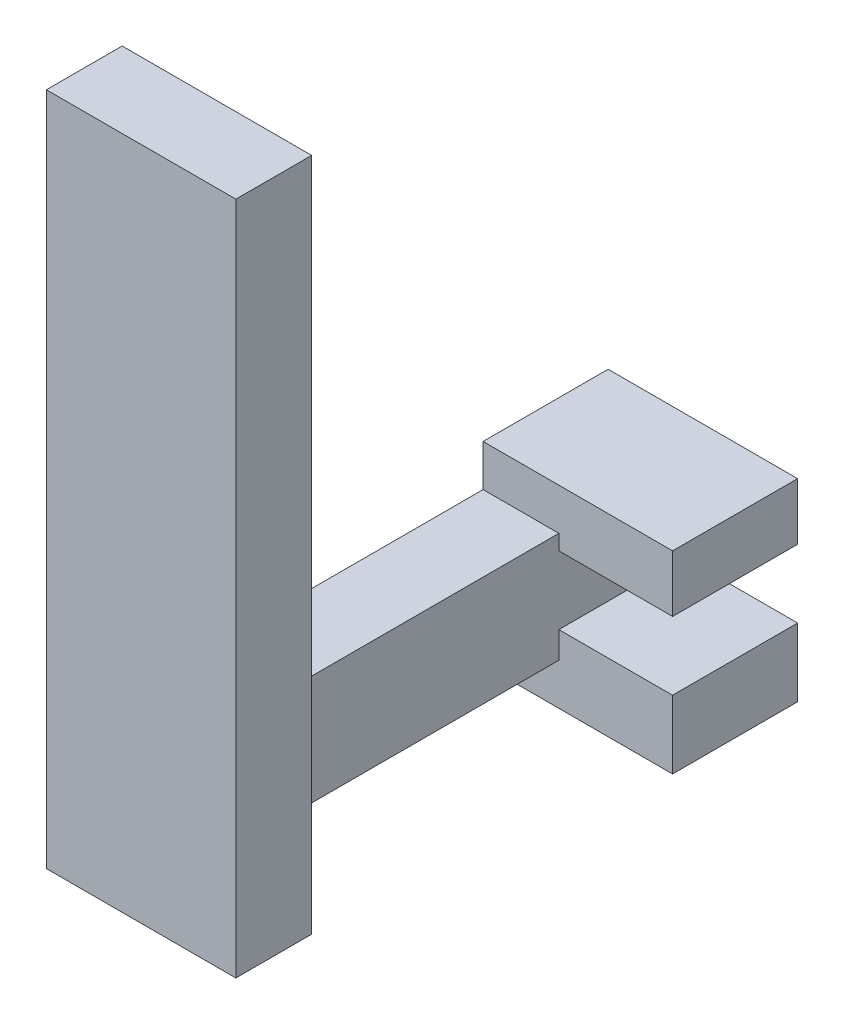
ISO-10303-21;
HEADER;
FILE_DESCRIPTION(('STEP AP214'),'2;1');
FILE_NAME('part.step','',(''),(''),'','','');
FILE_SCHEMA(('AUTOMOTIVE_DESIGN { 1 0 10303 214 1 1 1 1 }'));
ENDSEC;
DATA;
#1=APPLICATION_CONTEXT('core data for automotive mechanical design processes');
#2=APPLICATION_PROTOCOL_DEFINITION('international standard','automotive_design',2000,#1);
#3=PRODUCT_CONTEXT('',#1,'mechanical');
#4=PRODUCT('Part','Part','',(#3));
#5=PRODUCT_RELATED_PRODUCT_CATEGORY('part','',(#4));
#6=PRODUCT_DEFINITION_FORMATION('','',#4);
#7=PRODUCT_DEFINITION_CONTEXT('part definition',#1,'design');
#8=PRODUCT_DEFINITION('design','',#6,#7);
#9=PRODUCT_DEFINITION_SHAPE('','',#8);
#10=(LENGTH_UNIT() NAMED_UNIT(*) SI_UNIT(.MILLI.,.METRE.));
#11=(NAMED_UNIT(*) PLANE_ANGLE_UNIT() SI_UNIT($,.RADIAN.));
#12=(NAMED_UNIT(*) SI_UNIT($,.STERADIAN.) SOLID_ANGLE_UNIT());
#13=UNCERTAINTY_MEASURE_WITH_UNIT(LENGTH_MEASURE(1.E-05),#10,'distance_accuracy_value','');
#14=(GEOMETRIC_REPRESENTATION_CONTEXT(3) GLOBAL_UNCERTAINTY_ASSIGNED_CONTEXT((#13)) GLOBAL_UNIT_ASSIGNED_CONTEXT((#10,
#11,#12)) REPRESENTATION_CONTEXT('',''));
#15=CARTESIAN_POINT('',(0.,0.,0.));
#16=DIRECTION('',(0.,0.,1.));
#17=DIRECTION('',(1.,0.,0.));
#18=AXIS2_PLACEMENT_3D('',#15,#16,#17);
#19=CARTESIAN_POINT('',(1.,2.9,6.));
#20=DIRECTION('',(-1.,0.,0.));
#21=DIRECTION('',(0.,0.,1.));
#22=AXIS2_PLACEMENT_3D('',#19,#20,#21);
#23=PLANE('',#22);
#24=DIRECTION('',(0.,1.,0.));
#25=VECTOR('',#24,1.);
#26=CARTESIAN_POINT('',(1.,2.9,6.825));
#27=LINE('',#26,#25);
#28=CARTESIAN_POINT('',(1.,0.,6.825));
#29=VERTEX_POINT('',#28);
#30=CARTESIAN_POINT('',(1.,2.9,6.825));
#31=VERTEX_POINT('',#30);
#32=EDGE_CURVE('E206',#29,#31,#27,.T.);
#33=ORIENTED_EDGE('',*,*,#32,.F.);
#34=DIRECTION('',(0.,0.,-1.));
#35=VECTOR('',#34,1.);
#36=CARTESIAN_POINT('',(1.,0.,6.));
#37=LINE('',#36,#35);
#38=CARTESIAN_POINT('',(1.,0.,-2.7));
#39=VERTEX_POINT('',#38);
#40=EDGE_CURVE('E265',#29,#39,#37,.T.);
#41=ORIENTED_EDGE('',*,*,#40,.T.);
#42=DIRECTION('',(0.,1.,0.));
#43=VECTOR('',#42,1.);
#44=CARTESIAN_POINT('',(1.,2.9,-2.7));
#45=LINE('',#44,#43);
#46=CARTESIAN_POINT('',(1.,0.7,-2.7));
#47=VERTEX_POINT('',#46);
#48=EDGE_CURVE('E213',#39,#47,#45,.T.);
#49=ORIENTED_EDGE('',*,*,#48,.T.);
#50=DIRECTION('',(0.,0.,-1.));
#51=VECTOR('',#50,1.);
#52=CARTESIAN_POINT('',(1.,0.699999999999998,6.));
#53=LINE('',#52,#51);
#54=CARTESIAN_POINT('',(1.,0.7,-6.));
#55=VERTEX_POINT('',#54);
#56=EDGE_CURVE('E234',#47,#55,#53,.T.);
#57=ORIENTED_EDGE('',*,*,#56,.T.);
#58=DIRECTION('',(0.,-1.,0.));
#59=VECTOR('',#58,1.);
#60=CARTESIAN_POINT('',(1.,2.9,-6.));
#61=LINE('',#60,#59);
#62=CARTESIAN_POINT('',(1.,2.5,-6.));
#63=VERTEX_POINT('',#62);
#64=EDGE_CURVE('E276',#63,#55,#61,.T.);
#65=ORIENTED_EDGE('',*,*,#64,.F.);
#66=DIRECTION('',(0.,0.,1.));
#67=VECTOR('',#66,1.);
#68=CARTESIAN_POINT('',(1.,2.5,6.));
#69=LINE('',#68,#67);
#70=CARTESIAN_POINT('',(1.,2.5,-2.7));
#71=VERTEX_POINT('',#70);
#72=EDGE_CURVE('E80',#63,#71,#69,.T.);
#73=ORIENTED_EDGE('',*,*,#72,.T.);
#74=DIRECTION('',(0.,1.,0.));
#75=VECTOR('',#74,1.);
#76=CARTESIAN_POINT('',(1.,2.9,-2.7));
#77=LINE('',#76,#75);
#78=CARTESIAN_POINT('',(1.,2.9,-2.7));
#79=VERTEX_POINT('',#78);
#80=EDGE_CURVE('E244',#71,#79,#77,.T.);
#81=ORIENTED_EDGE('',*,*,#80,.T.);
#82=DIRECTION('',(0.,0.,-1.));
#83=VECTOR('',#82,1.);
#84=CARTESIAN_POINT('',(1.,2.9,6.));
#85=LINE('',#84,#83);
#86=EDGE_CURVE('E266',#31,#79,#85,.T.);
#87=ORIENTED_EDGE('',*,*,#86,.F.);
#88=EDGE_LOOP('',(#33,#41,#49,#57,#65,#73,#81,#87));
#89=FACE_BOUND('',#88,.T.);
#90=ADVANCED_FACE('F59',(#89),#23,.F.);
#91=CARTESIAN_POINT('',(0.,2.9,0.));
#92=DIRECTION('',(0.,-1.,0.));
#93=DIRECTION('',(0.,0.,-1.));
#94=AXIS2_PLACEMENT_3D('',#91,#92,#93);
#95=PLANE('',#94);
#96=DIRECTION('',(-1.,0.,0.));
#97=VECTOR('',#96,1.);
#98=CARTESIAN_POINT('',(0.,2.9,6.825));
#99=LINE('',#98,#97);
#100=CARTESIAN_POINT('',(-1.,2.9,6.825));
#101=VERTEX_POINT('',#100);
#102=EDGE_CURVE('E174',#31,#101,#99,.T.);
#103=ORIENTED_EDGE('',*,*,#102,.F.);
#104=ORIENTED_EDGE('',*,*,#86,.T.);
#105=DIRECTION('',(-1.,0.,0.));
#106=VECTOR('',#105,1.);
#107=CARTESIAN_POINT('',(0.,2.9,-2.7));
#108=LINE('',#107,#106);
#109=CARTESIAN_POINT('',(-1.,2.9,-2.7));
#110=VERTEX_POINT('',#109);
#111=EDGE_CURVE('E66',#79,#110,#108,.T.);
#112=ORIENTED_EDGE('',*,*,#111,.T.);
#113=DIRECTION('',(0.,0.,1.));
#114=VECTOR('',#113,1.);
#115=CARTESIAN_POINT('',(-1.,2.9,6.));
#116=LINE('',#115,#114);
#117=EDGE_CURVE('E268',#110,#101,#116,.T.);
#118=ORIENTED_EDGE('',*,*,#117,.T.);
#119=EDGE_LOOP('',(#103,#104,#112,#118));
#120=FACE_BOUND('',#119,.T.);
#121=ADVANCED_FACE('F283',(#120),#95,.F.);
#122=CARTESIAN_POINT('',(-1.,2.9,-6.));
#123=DIRECTION('',(0.,0.,1.));
#124=DIRECTION('',(1.,0.,0.));
#125=AXIS2_PLACEMENT_3D('',#122,#123,#124);
#126=PLANE('',#125);
#127=ORIENTED_EDGE('',*,*,#64,.T.);
#128=DIRECTION('',(1.,0.,0.));
#129=VECTOR('',#128,1.);
#130=CARTESIAN_POINT('',(-4.7589892258425,0.7,-6.));
#131=LINE('',#130,#129);
#132=CARTESIAN_POINT('',(4.,0.7,-6.));
#133=VERTEX_POINT('',#132);
#134=EDGE_CURVE('E225',#55,#133,#131,.T.);
#135=ORIENTED_EDGE('',*,*,#134,.T.);
#136=DIRECTION('',(0.,1.,0.));
#137=VECTOR('',#136,1.);
#138=CARTESIAN_POINT('',(4.,0.7,-6.));
#139=LINE('',#138,#137);
#140=CARTESIAN_POINT('',(4.,-1.1,-6.));
#141=VERTEX_POINT('',#140);
#142=EDGE_CURVE('E208',#141,#133,#139,.T.);
#143=ORIENTED_EDGE('',*,*,#142,.F.);
#144=DIRECTION('',(1.,0.,0.));
#145=VECTOR('',#144,1.);
#146=CARTESIAN_POINT('',(-4.7589892258425,-1.1,-6.));
#147=LINE('',#146,#145);
#148=CARTESIAN_POINT('',(-1.,-1.1,-6.));
#149=VERTEX_POINT('',#148);
#150=EDGE_CURVE('E211',#149,#141,#147,.T.);
#151=ORIENTED_EDGE('',*,*,#150,.F.);
#152=DIRECTION('',(0.,-1.,0.));
#153=VECTOR('',#152,1.);
#154=CARTESIAN_POINT('',(-1.,2.9,-6.));
#155=LINE('',#154,#153);
#156=CARTESIAN_POINT('',(-1.,4.,-6.));
#157=VERTEX_POINT('',#156);
#158=EDGE_CURVE('E272',#157,#149,#155,.T.);
#159=ORIENTED_EDGE('',*,*,#158,.F.);
#160=DIRECTION('',(1.,0.,0.));
#161=VECTOR('',#160,1.);
#162=CARTESIAN_POINT('',(-4.7589892258425,4.,-6.));
#163=LINE('',#162,#161);
#164=CARTESIAN_POINT('',(4.,4.,-6.));
#165=VERTEX_POINT('',#164);
#166=EDGE_CURVE('E258',#157,#165,#163,.T.);
#167=ORIENTED_EDGE('',*,*,#166,.T.);
#168=DIRECTION('',(0.,1.,0.));
#169=VECTOR('',#168,1.);
#170=CARTESIAN_POINT('',(4.,2.5,-6.));
#171=LINE('',#170,#169);
#172=CARTESIAN_POINT('',(4.,2.5,-6.));
#173=VERTEX_POINT('',#172);
#174=EDGE_CURVE('E250',#173,#165,#171,.T.);
#175=ORIENTED_EDGE('',*,*,#174,.F.);
#176=DIRECTION('',(1.,0.,0.));
#177=VECTOR('',#176,1.);
#178=CARTESIAN_POINT('',(-4.7589892258425,2.5,-6.));
#179=LINE('',#178,#177);
#180=EDGE_CURVE('E260',#63,#173,#179,.T.);
#181=ORIENTED_EDGE('',*,*,#180,.F.);
#182=EDGE_LOOP('',(#127,#135,#143,#151,#159,#167,#175,#181));
#183=FACE_BOUND('',#182,.T.);
#184=ADVANCED_FACE('F297',(#183),#126,.F.);
#185=CARTESIAN_POINT('',(-1.,2.9,6.));
#186=DIRECTION('',(1.,0.,0.));
#187=DIRECTION('',(0.,0.,-1.));
#188=AXIS2_PLACEMENT_3D('',#185,#186,#187);
#189=PLANE('',#188);
#190=DIRECTION('',(0.,-1.,0.));
#191=VECTOR('',#190,1.);
#192=CARTESIAN_POINT('',(-1.,17.8,6.825));
#193=LINE('',#192,#191);
#194=CARTESIAN_POINT('',(-1.,17.8,6.825));
#195=VERTEX_POINT('',#194);
#196=EDGE_CURVE('E175',#195,#101,#193,.T.);
#197=ORIENTED_EDGE('',*,*,#196,.T.);
#198=ORIENTED_EDGE('',*,*,#117,.F.);
#199=DIRECTION('',(0.,1.,0.));
#200=VECTOR('',#199,1.);
#201=CARTESIAN_POINT('',(-1.,2.5,-2.7));
#202=LINE('',#201,#200);
#203=CARTESIAN_POINT('',(-1.,4.,-2.7));
#204=VERTEX_POINT('',#203);
#205=EDGE_CURVE('E241',#110,#204,#202,.T.);
#206=ORIENTED_EDGE('',*,*,#205,.T.);
#207=DIRECTION('',(0.,0.,-1.));
#208=VECTOR('',#207,1.);
#209=CARTESIAN_POINT('',(-1.,4.,-2.7));
#210=LINE('',#209,#208);
#211=EDGE_CURVE('E238',#204,#157,#210,.T.);
#212=ORIENTED_EDGE('',*,*,#211,.T.);
#213=ORIENTED_EDGE('',*,*,#158,.T.);
#214=DIRECTION('',(0.,0.,1.));
#215=VECTOR('',#214,1.);
#216=CARTESIAN_POINT('',(-1.,-1.1,-6.));
#217=LINE('',#216,#215);
#218=CARTESIAN_POINT('',(-1.,-1.1,-2.7));
#219=VERTEX_POINT('',#218);
#220=EDGE_CURVE('E210',#149,#219,#217,.T.);
#221=ORIENTED_EDGE('',*,*,#220,.T.);
#222=DIRECTION('',(0.,1.,0.));
#223=VECTOR('',#222,1.);
#224=CARTESIAN_POINT('',(-1.,0.7,-2.7));
#225=LINE('',#224,#223);
#226=CARTESIAN_POINT('',(-1.,0.,-2.7));
#227=VERTEX_POINT('',#226);
#228=EDGE_CURVE('E73',#219,#227,#225,.T.);
#229=ORIENTED_EDGE('',*,*,#228,.T.);
#230=DIRECTION('',(0.,0.,1.));
#231=VECTOR('',#230,1.);
#232=CARTESIAN_POINT('',(-1.,0.,6.));
#233=LINE('',#232,#231);
#234=CARTESIAN_POINT('',(-0.999999999999999,0.,8.825));
#235=VERTEX_POINT('',#234);
#236=EDGE_CURVE('E269',#227,#235,#233,.T.);
#237=ORIENTED_EDGE('',*,*,#236,.T.);
#238=DIRECTION('',(0.,-1.,0.));
#239=VECTOR('',#238,1.);
#240=CARTESIAN_POINT('',(-0.999999999999999,17.8,8.825));
#241=LINE('',#240,#239);
#242=CARTESIAN_POINT('',(-0.999999999999999,17.8,8.825));
#243=VERTEX_POINT('',#242);
#244=EDGE_CURVE('E194',#243,#235,#241,.T.);
#245=ORIENTED_EDGE('',*,*,#244,.F.);
#246=DIRECTION('',(0.,0.,1.));
#247=VECTOR('',#246,1.);
#248=CARTESIAN_POINT('',(-1.,17.8,0.));
#249=LINE('',#248,#247);
#250=EDGE_CURVE('E188',#195,#243,#249,.T.);
#251=ORIENTED_EDGE('',*,*,#250,.F.);
#252=EDGE_LOOP('',(#197,#198,#206,#212,#213,#221,#229,#237,#245,#251));
#253=FACE_BOUND('',#252,.T.);
#254=ADVANCED_FACE('F290',(#253),#189,.F.);
#255=CARTESIAN_POINT('',(0.,0.,0.));
#256=DIRECTION('',(0.,-1.,0.));
#257=DIRECTION('',(0.,0.,-1.));
#258=AXIS2_PLACEMENT_3D('',#255,#256,#257);
#259=PLANE('',#258);
#260=ORIENTED_EDGE('',*,*,#40,.F.);
#261=DIRECTION('',(-1.,0.,0.));
#262=VECTOR('',#261,1.);
#263=CARTESIAN_POINT('',(0.,0.,6.825));
#264=LINE('',#263,#262);
#265=CARTESIAN_POINT('',(4.,0.,6.825));
#266=VERTEX_POINT('',#265);
#267=EDGE_CURVE('E190',#266,#29,#264,.T.);
#268=ORIENTED_EDGE('',*,*,#267,.F.);
#269=DIRECTION('',(0.,0.,1.));
#270=VECTOR('',#269,1.);
#271=CARTESIAN_POINT('',(4.,0.,0.));
#272=LINE('',#271,#270);
#273=CARTESIAN_POINT('',(4.,0.,8.825));
#274=VERTEX_POINT('',#273);
#275=EDGE_CURVE('E171',#266,#274,#272,.T.);
#276=ORIENTED_EDGE('',*,*,#275,.T.);
#277=DIRECTION('',(-1.,0.,0.));
#278=VECTOR('',#277,1.);
#279=CARTESIAN_POINT('',(0.,0.,8.825));
#280=LINE('',#279,#278);
#281=EDGE_CURVE('E199',#274,#235,#280,.T.);
#282=ORIENTED_EDGE('',*,*,#281,.T.);
#283=ORIENTED_EDGE('',*,*,#236,.F.);
#284=DIRECTION('',(-1.,0.,0.));
#285=VECTOR('',#284,1.);
#286=CARTESIAN_POINT('',(0.,0.,-2.7));
#287=LINE('',#286,#285);
#288=EDGE_CURVE('E12',#39,#227,#287,.T.);
#289=ORIENTED_EDGE('',*,*,#288,.F.);
#290=EDGE_LOOP('',(#260,#268,#276,#282,#283,#289));
#291=FACE_BOUND('',#290,.T.);
#292=ADVANCED_FACE('F327',(#291),#259,.T.);
#293=CARTESIAN_POINT('',(-4.7589892258425,2.5,-2.7));
#294=DIRECTION('',(0.,-1.,0.));
#295=DIRECTION('',(0.,0.,-1.));
#296=AXIS2_PLACEMENT_3D('',#293,#294,#295);
#297=PLANE('',#296);
#298=ORIENTED_EDGE('',*,*,#72,.F.);
#299=ORIENTED_EDGE('',*,*,#180,.T.);
#300=DIRECTION('',(0.,0.,-1.));
#301=VECTOR('',#300,1.);
#302=CARTESIAN_POINT('',(4.,2.5,-2.7));
#303=LINE('',#302,#301);
#304=CARTESIAN_POINT('',(4.,2.5,-2.7));
#305=VERTEX_POINT('',#304);
#306=EDGE_CURVE('E247',#305,#173,#303,.T.);
#307=ORIENTED_EDGE('',*,*,#306,.F.);
#308=DIRECTION('',(1.,0.,0.));
#309=VECTOR('',#308,1.);
#310=CARTESIAN_POINT('',(-4.7589892258425,2.5,-2.7));
#311=LINE('',#310,#309);
#312=EDGE_CURVE('E256',#71,#305,#311,.T.);
#313=ORIENTED_EDGE('',*,*,#312,.F.);
#314=EDGE_LOOP('',(#298,#299,#307,#313));
#315=FACE_BOUND('',#314,.T.);
#316=ADVANCED_FACE('F305',(#315),#297,.T.);
#317=CARTESIAN_POINT('',(-4.7589892258425,2.5,-2.7));
#318=DIRECTION('',(0.,0.,1.));
#319=DIRECTION('',(1.,0.,0.));
#320=AXIS2_PLACEMENT_3D('',#317,#318,#319);
#321=PLANE('',#320);
#322=ORIENTED_EDGE('',*,*,#80,.F.);
#323=ORIENTED_EDGE('',*,*,#312,.T.);
#324=DIRECTION('',(0.,-1.,0.));
#325=VECTOR('',#324,1.);
#326=CARTESIAN_POINT('',(4.,2.5,-2.7));
#327=LINE('',#326,#325);
#328=CARTESIAN_POINT('',(4.,4.,-2.7));
#329=VERTEX_POINT('',#328);
#330=EDGE_CURVE('E237',#329,#305,#327,.T.);
#331=ORIENTED_EDGE('',*,*,#330,.F.);
#332=DIRECTION('',(1.,0.,0.));
#333=VECTOR('',#332,1.);
#334=CARTESIAN_POINT('',(-4.7589892258425,4.,-2.7));
#335=LINE('',#334,#333);
#336=EDGE_CURVE('E242',#204,#329,#335,.T.);
#337=ORIENTED_EDGE('',*,*,#336,.F.);
#338=ORIENTED_EDGE('',*,*,#205,.F.);
#339=ORIENTED_EDGE('',*,*,#111,.F.);
#340=EDGE_LOOP('',(#322,#323,#331,#337,#338,#339));
#341=FACE_BOUND('',#340,.T.);
#342=ADVANCED_FACE('F287',(#341),#321,.T.);
#343=CARTESIAN_POINT('',(-4.7589892258425,4.,-2.7));
#344=DIRECTION('',(0.,1.,0.));
#345=DIRECTION('',(0.,0.,1.));
#346=AXIS2_PLACEMENT_3D('',#343,#344,#345);
#347=PLANE('',#346);
#348=ORIENTED_EDGE('',*,*,#211,.F.);
#349=ORIENTED_EDGE('',*,*,#336,.T.);
#350=DIRECTION('',(0.,0.,1.));
#351=VECTOR('',#350,1.);
#352=CARTESIAN_POINT('',(4.,4.,-2.7));
#353=LINE('',#352,#351);
#354=EDGE_CURVE('E253',#165,#329,#353,.T.);
#355=ORIENTED_EDGE('',*,*,#354,.F.);
#356=ORIENTED_EDGE('',*,*,#166,.F.);
#357=EDGE_LOOP('',(#348,#349,#355,#356));
#358=FACE_BOUND('',#357,.T.);
#359=ADVANCED_FACE('F293',(#358),#347,.T.);
#360=CARTESIAN_POINT('',(4.,0.,0.));
#361=DIRECTION('',(-1.,0.,0.));
#362=DIRECTION('',(0.,0.,1.));
#363=AXIS2_PLACEMENT_3D('',#360,#361,#362);
#364=PLANE('',#363);
#365=ORIENTED_EDGE('',*,*,#330,.T.);
#366=ORIENTED_EDGE('',*,*,#306,.T.);
#367=ORIENTED_EDGE('',*,*,#174,.T.);
#368=ORIENTED_EDGE('',*,*,#354,.T.);
#369=EDGE_LOOP('',(#365,#366,#367,#368));
#370=FACE_BOUND('',#369,.T.);
#371=ADVANCED_FACE('F301',(#370),#364,.F.);
#372=CARTESIAN_POINT('',(-4.7589892258425,0.7,-6.));
#373=DIRECTION('',(0.,1.,0.));
#374=DIRECTION('',(0.,0.,1.));
#375=AXIS2_PLACEMENT_3D('',#372,#373,#374);
#376=PLANE('',#375);
#377=ORIENTED_EDGE('',*,*,#56,.F.);
#378=DIRECTION('',(1.,0.,0.));
#379=VECTOR('',#378,1.);
#380=CARTESIAN_POINT('',(-4.7589892258425,0.7,-2.7));
#381=LINE('',#380,#379);
#382=CARTESIAN_POINT('',(4.,0.7,-2.7));
#383=VERTEX_POINT('',#382);
#384=EDGE_CURVE('E229',#47,#383,#381,.T.);
#385=ORIENTED_EDGE('',*,*,#384,.T.);
#386=DIRECTION('',(0.,0.,1.));
#387=VECTOR('',#386,1.);
#388=CARTESIAN_POINT('',(4.,0.7,-6.));
#389=LINE('',#388,#387);
#390=EDGE_CURVE('E216',#133,#383,#389,.T.);
#391=ORIENTED_EDGE('',*,*,#390,.F.);
#392=ORIENTED_EDGE('',*,*,#134,.F.);
#393=EDGE_LOOP('',(#377,#385,#391,#392));
#394=FACE_BOUND('',#393,.T.);
#395=ADVANCED_FACE('F312',(#394),#376,.T.);
#396=CARTESIAN_POINT('',(-4.7589892258425,0.7,-2.7));
#397=DIRECTION('',(0.,0.,1.));
#398=DIRECTION('',(0.,-1.,0.));
#399=AXIS2_PLACEMENT_3D('',#396,#397,#398);
#400=PLANE('',#399);
#401=ORIENTED_EDGE('',*,*,#48,.F.);
#402=ORIENTED_EDGE('',*,*,#288,.T.);
#403=ORIENTED_EDGE('',*,*,#228,.F.);
#404=DIRECTION('',(1.,0.,0.));
#405=VECTOR('',#404,1.);
#406=CARTESIAN_POINT('',(-4.7589892258425,-1.1,-2.7));
#407=LINE('',#406,#405);
#408=CARTESIAN_POINT('',(4.,-1.1,-2.7));
#409=VERTEX_POINT('',#408);
#410=EDGE_CURVE('E227',#219,#409,#407,.T.);
#411=ORIENTED_EDGE('',*,*,#410,.T.);
#412=DIRECTION('',(0.,-1.,0.));
#413=VECTOR('',#412,1.);
#414=CARTESIAN_POINT('',(4.,0.7,-2.7));
#415=LINE('',#414,#413);
#416=EDGE_CURVE('E219',#383,#409,#415,.T.);
#417=ORIENTED_EDGE('',*,*,#416,.F.);
#418=ORIENTED_EDGE('',*,*,#384,.F.);
#419=EDGE_LOOP('',(#401,#402,#403,#411,#417,#418));
#420=FACE_BOUND('',#419,.T.);
#421=ADVANCED_FACE('F315',(#420),#400,.T.);
#422=CARTESIAN_POINT('',(-4.7589892258425,-1.1,-6.));
#423=DIRECTION('',(0.,-1.,0.));
#424=DIRECTION('',(0.,0.,-1.));
#425=AXIS2_PLACEMENT_3D('',#422,#423,#424);
#426=PLANE('',#425);
#427=ORIENTED_EDGE('',*,*,#220,.F.);
#428=ORIENTED_EDGE('',*,*,#150,.T.);
#429=DIRECTION('',(0.,0.,-1.));
#430=VECTOR('',#429,1.);
#431=CARTESIAN_POINT('',(4.,-1.1,-6.));
#432=LINE('',#431,#430);
#433=EDGE_CURVE('E222',#409,#141,#432,.T.);
#434=ORIENTED_EDGE('',*,*,#433,.F.);
#435=ORIENTED_EDGE('',*,*,#410,.F.);
#436=EDGE_LOOP('',(#427,#428,#434,#435));
#437=FACE_BOUND('',#436,.T.);
#438=ADVANCED_FACE('F323',(#437),#426,.T.);
#439=CARTESIAN_POINT('',(4.,0.,0.));
#440=DIRECTION('',(-1.,0.,0.));
#441=DIRECTION('',(0.,0.,1.));
#442=AXIS2_PLACEMENT_3D('',#439,#440,#441);
#443=PLANE('',#442);
#444=ORIENTED_EDGE('',*,*,#142,.T.);
#445=ORIENTED_EDGE('',*,*,#390,.T.);
#446=ORIENTED_EDGE('',*,*,#416,.T.);
#447=ORIENTED_EDGE('',*,*,#433,.T.);
#448=EDGE_LOOP('',(#444,#445,#446,#447));
#449=FACE_BOUND('',#448,.T.);
#450=ADVANCED_FACE('F320',(#449),#443,.F.);
#451=CARTESIAN_POINT('',(0.,17.8,6.825));
#452=DIRECTION('',(0.,0.,1.));
#453=DIRECTION('',(1.,0.,0.));
#454=AXIS2_PLACEMENT_3D('',#451,#452,#453);
#455=PLANE('',#454);
#456=ORIENTED_EDGE('',*,*,#267,.T.);
#457=ORIENTED_EDGE('',*,*,#32,.T.);
#458=ORIENTED_EDGE('',*,*,#102,.T.);
#459=ORIENTED_EDGE('',*,*,#196,.F.);
#460=DIRECTION('',(-1.,0.,0.));
#461=VECTOR('',#460,1.);
#462=CARTESIAN_POINT('',(0.,17.8,6.825));
#463=LINE('',#462,#461);
#464=CARTESIAN_POINT('',(4.,17.8,6.825));
#465=VERTEX_POINT('',#464);
#466=EDGE_CURVE('E178',#465,#195,#463,.T.);
#467=ORIENTED_EDGE('',*,*,#466,.F.);
#468=DIRECTION('',(0.,-1.,0.));
#469=VECTOR('',#468,1.);
#470=CARTESIAN_POINT('',(4.,17.8,6.825));
#471=LINE('',#470,#469);
#472=EDGE_CURVE('E164',#465,#266,#471,.T.);
#473=ORIENTED_EDGE('',*,*,#472,.T.);
#474=EDGE_LOOP('',(#456,#457,#458,#459,#467,#473));
#475=FACE_BOUND('',#474,.T.);
#476=ADVANCED_FACE('F179',(#475),#455,.F.);
#477=CARTESIAN_POINT('',(4.,17.8,0.));
#478=DIRECTION('',(1.,0.,0.));
#479=DIRECTION('',(0.,0.,-1.));
#480=AXIS2_PLACEMENT_3D('',#477,#478,#479);
#481=PLANE('',#480);
#482=ORIENTED_EDGE('',*,*,#275,.F.);
#483=ORIENTED_EDGE('',*,*,#472,.F.);
#484=DIRECTION('',(0.,0.,1.));
#485=VECTOR('',#484,1.);
#486=CARTESIAN_POINT('',(4.,17.8,0.));
#487=LINE('',#486,#485);
#488=CARTESIAN_POINT('',(4.,17.8,8.825));
#489=VERTEX_POINT('',#488);
#490=EDGE_CURVE('E169',#465,#489,#487,.T.);
#491=ORIENTED_EDGE('',*,*,#490,.T.);
#492=DIRECTION('',(0.,-1.,0.));
#493=VECTOR('',#492,1.);
#494=CARTESIAN_POINT('',(4.,17.8,8.825));
#495=LINE('',#494,#493);
#496=EDGE_CURVE('E198',#489,#274,#495,.T.);
#497=ORIENTED_EDGE('',*,*,#496,.T.);
#498=EDGE_LOOP('',(#482,#483,#491,#497));
#499=FACE_BOUND('',#498,.T.);
#500=ADVANCED_FACE('F166',(#499),#481,.T.);
#501=CARTESIAN_POINT('',(0.,17.8,0.));
#502=DIRECTION('',(0.,-1.,0.));
#503=DIRECTION('',(0.,0.,-1.));
#504=AXIS2_PLACEMENT_3D('',#501,#502,#503);
#505=PLANE('',#504);
#506=ORIENTED_EDGE('',*,*,#250,.T.);
#507=DIRECTION('',(-1.,0.,0.));
#508=VECTOR('',#507,1.);
#509=CARTESIAN_POINT('',(0.,17.8,8.825));
#510=LINE('',#509,#508);
#511=EDGE_CURVE('E187',#489,#243,#510,.T.);
#512=ORIENTED_EDGE('',*,*,#511,.F.);
#513=ORIENTED_EDGE('',*,*,#490,.F.);
#514=ORIENTED_EDGE('',*,*,#466,.T.);
#515=EDGE_LOOP('',(#506,#512,#513,#514));
#516=FACE_BOUND('',#515,.T.);
#517=ADVANCED_FACE('F185',(#516),#505,.F.);
#518=CARTESIAN_POINT('',(0.,17.8,8.825));
#519=DIRECTION('',(0.,0.,1.));
#520=DIRECTION('',(1.,0.,0.));
#521=AXIS2_PLACEMENT_3D('',#518,#519,#520);
#522=PLANE('',#521);
#523=ORIENTED_EDGE('',*,*,#281,.F.);
#524=ORIENTED_EDGE('',*,*,#496,.F.);
#525=ORIENTED_EDGE('',*,*,#511,.T.);
#526=ORIENTED_EDGE('',*,*,#244,.T.);
#527=EDGE_LOOP('',(#523,#524,#525,#526));
#528=FACE_BOUND('',#527,.T.);
#529=ADVANCED_FACE('F331',(#528),#522,.T.);
#530=CLOSED_SHELL('',(#90,#121,#184,#254,#292,#316,#342,#359,#371,#395,#421,#438,#450,#476,#500,
#517,#529));
#531=MANIFOLD_SOLID_BREP('B2',#530);
#532=ADVANCED_BREP_SHAPE_REPRESENTATION('',(#18,#531),#14);
#533=SHAPE_DEFINITION_REPRESENTATION(#9,#532);
ENDSEC;
END-ISO-10303-21;
